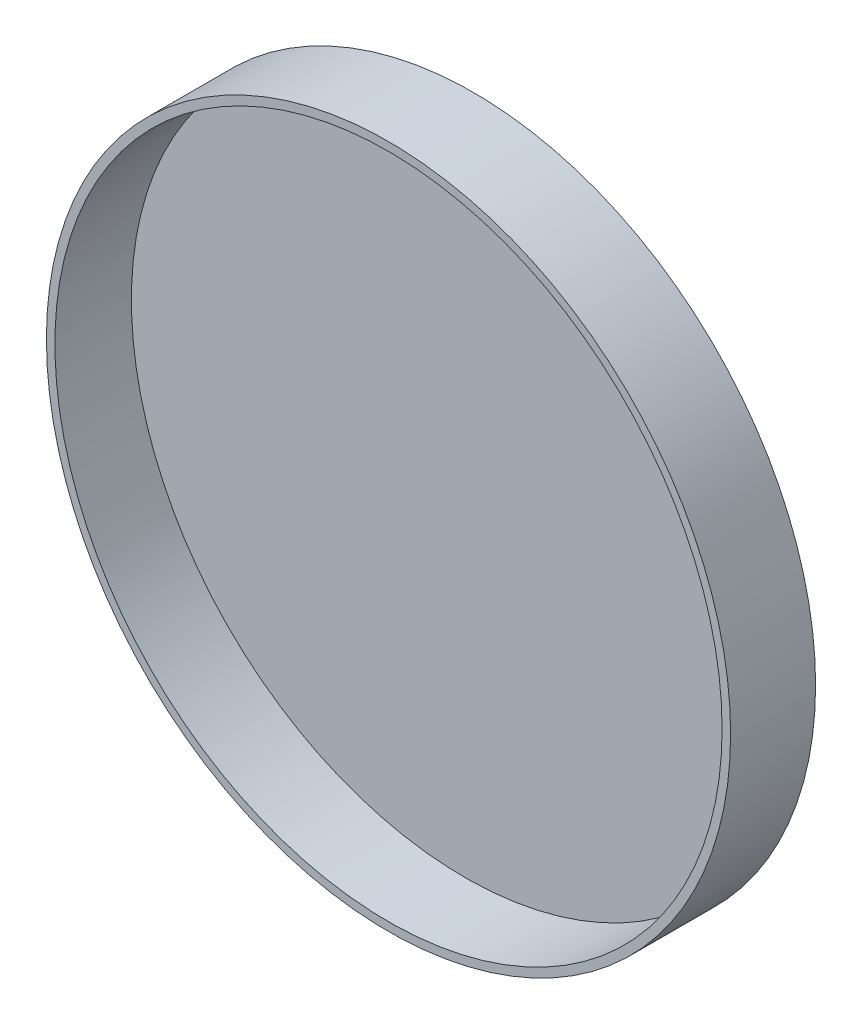
ISO-10303-21;
HEADER;
FILE_DESCRIPTION(('STEP AP214'),'2;1');
FILE_NAME('part.step','',(''),(''),'','','');
FILE_SCHEMA(('AUTOMOTIVE_DESIGN { 1 0 10303 214 1 1 1 1 }'));
ENDSEC;
DATA;
#1=APPLICATION_CONTEXT('core data for automotive mechanical design processes');
#2=APPLICATION_PROTOCOL_DEFINITION('international standard','automotive_design',2000,#1);
#3=PRODUCT_CONTEXT('',#1,'mechanical');
#4=PRODUCT('Part','Part','',(#3));
#5=PRODUCT_RELATED_PRODUCT_CATEGORY('part','',(#4));
#6=PRODUCT_DEFINITION_FORMATION('','',#4);
#7=PRODUCT_DEFINITION_CONTEXT('part definition',#1,'design');
#8=PRODUCT_DEFINITION('design','',#6,#7);
#9=PRODUCT_DEFINITION_SHAPE('','',#8);
#10=(LENGTH_UNIT() NAMED_UNIT(*) SI_UNIT(.MILLI.,.METRE.));
#11=(NAMED_UNIT(*) PLANE_ANGLE_UNIT() SI_UNIT($,.RADIAN.));
#12=(NAMED_UNIT(*) SI_UNIT($,.STERADIAN.) SOLID_ANGLE_UNIT());
#13=UNCERTAINTY_MEASURE_WITH_UNIT(LENGTH_MEASURE(1.E-05),#10,'distance_accuracy_value','');
#14=(GEOMETRIC_REPRESENTATION_CONTEXT(3) GLOBAL_UNCERTAINTY_ASSIGNED_CONTEXT((#13)) GLOBAL_UNIT_ASSIGNED_CONTEXT((#10,
#11,#12)) REPRESENTATION_CONTEXT('',''));
#15=CARTESIAN_POINT('',(0.,0.,0.));
#16=DIRECTION('',(0.,0.,1.));
#17=DIRECTION('',(1.,0.,0.));
#18=AXIS2_PLACEMENT_3D('',#15,#16,#17);
#19=CARTESIAN_POINT('',(0.,0.,1.));
#20=DIRECTION('',(0.,0.,-1.));
#21=DIRECTION('',(-1.,0.,0.));
#22=AXIS2_PLACEMENT_3D('',#19,#20,#21);
#23=CYLINDRICAL_SURFACE('',#22,40.25);
#24=CARTESIAN_POINT('',(0.,0.,0.));
#25=DIRECTION('',(0.,0.,1.));
#26=DIRECTION('',(1.,0.,0.));
#27=AXIS2_PLACEMENT_3D('',#24,#25,#26);
#28=CIRCLE('',#27,40.25);
#29=CARTESIAN_POINT('',(40.25,0.,0.));
#30=VERTEX_POINT('',#29);
#31=EDGE_CURVE('E44',#30,#30,#28,.T.);
#32=ORIENTED_EDGE('',*,*,#31,.T.);
#33=EDGE_LOOP('',(#32));
#34=FACE_BOUND('',#33,.T.);
#35=CARTESIAN_POINT('',(0.,0.,10.));
#36=DIRECTION('',(0.,0.,1.));
#37=DIRECTION('',(1.,0.,0.));
#38=AXIS2_PLACEMENT_3D('',#35,#36,#37);
#39=CIRCLE('',#38,40.25);
#40=CARTESIAN_POINT('',(40.25,0.,10.));
#41=VERTEX_POINT('',#40);
#42=EDGE_CURVE('E49',#41,#41,#39,.T.);
#43=ORIENTED_EDGE('',*,*,#42,.F.);
#44=EDGE_LOOP('',(#43));
#45=FACE_BOUND('',#44,.T.);
#46=ADVANCED_FACE('F37',(#34,#45),#23,.T.);
#47=CARTESIAN_POINT('',(0.,0.,0.));
#48=DIRECTION('',(0.,0.,1.));
#49=DIRECTION('',(1.,0.,0.));
#50=AXIS2_PLACEMENT_3D('',#47,#48,#49);
#51=PLANE('',#50);
#52=ORIENTED_EDGE('',*,*,#31,.F.);
#53=EDGE_LOOP('',(#52));
#54=FACE_BOUND('',#53,.T.);
#55=ADVANCED_FACE('F65',(#54),#51,.F.);
#56=CARTESIAN_POINT('',(0.,0.,10.));
#57=DIRECTION('',(0.,0.,1.));
#58=DIRECTION('',(1.,0.,0.));
#59=AXIS2_PLACEMENT_3D('',#56,#57,#58);
#60=PLANE('',#59);
#61=ORIENTED_EDGE('',*,*,#42,.T.);
#62=EDGE_LOOP('',(#61));
#63=FACE_BOUND('',#62,.T.);
#64=CARTESIAN_POINT('',(0.,0.,10.));
#65=DIRECTION('',(0.,0.,1.));
#66=DIRECTION('',(1.,0.,0.));
#67=AXIS2_PLACEMENT_3D('',#64,#65,#66);
#68=CIRCLE('',#67,39.25);
#69=CARTESIAN_POINT('',(39.25,0.,10.));
#70=VERTEX_POINT('',#69);
#71=EDGE_CURVE('E54',#70,#70,#68,.T.);
#72=ORIENTED_EDGE('',*,*,#71,.F.);
#73=EDGE_LOOP('',(#72));
#74=FACE_BOUND('',#73,.T.);
#75=ADVANCED_FACE('F63',(#63,#74),#60,.T.);
#76=CARTESIAN_POINT('',(0.,0.,10.));
#77=DIRECTION('',(0.,0.,-1.));
#78=DIRECTION('',(-1.,0.,0.));
#79=AXIS2_PLACEMENT_3D('',#76,#77,#78);
#80=CYLINDRICAL_SURFACE('',#79,39.25);
#81=ORIENTED_EDGE('',*,*,#71,.T.);
#82=EDGE_LOOP('',(#81));
#83=FACE_BOUND('',#82,.T.);
#84=CARTESIAN_POINT('',(0.,0.,1.));
#85=DIRECTION('',(0.,0.,1.));
#86=DIRECTION('',(1.,0.,0.));
#87=AXIS2_PLACEMENT_3D('',#84,#85,#86);
#88=CIRCLE('',#87,39.25);
#89=CARTESIAN_POINT('',(39.25,0.,1.));
#90=VERTEX_POINT('',#89);
#91=EDGE_CURVE('E10',#90,#90,#88,.F.);
#92=ORIENTED_EDGE('',*,*,#91,.T.);
#93=EDGE_LOOP('',(#92));
#94=FACE_BOUND('',#93,.T.);
#95=ADVANCED_FACE('F61',(#83,#94),#80,.F.);
#96=CARTESIAN_POINT('',(0.,0.,1.));
#97=DIRECTION('',(0.,0.,1.));
#98=DIRECTION('',(1.,0.,0.));
#99=AXIS2_PLACEMENT_3D('',#96,#97,#98);
#100=PLANE('',#99);
#101=ORIENTED_EDGE('',*,*,#91,.F.);
#102=EDGE_LOOP('',(#101));
#103=FACE_BOUND('',#102,.T.);
#104=ADVANCED_FACE('F72',(#103),#100,.T.);
#105=CLOSED_SHELL('',(#46,#55,#75,#95,#104));
#106=MANIFOLD_SOLID_BREP('B2',#105);
#107=ADVANCED_BREP_SHAPE_REPRESENTATION('',(#18,#106),#14);
#108=SHAPE_DEFINITION_REPRESENTATION(#9,#107);
ENDSEC;
END-ISO-10303-21;
